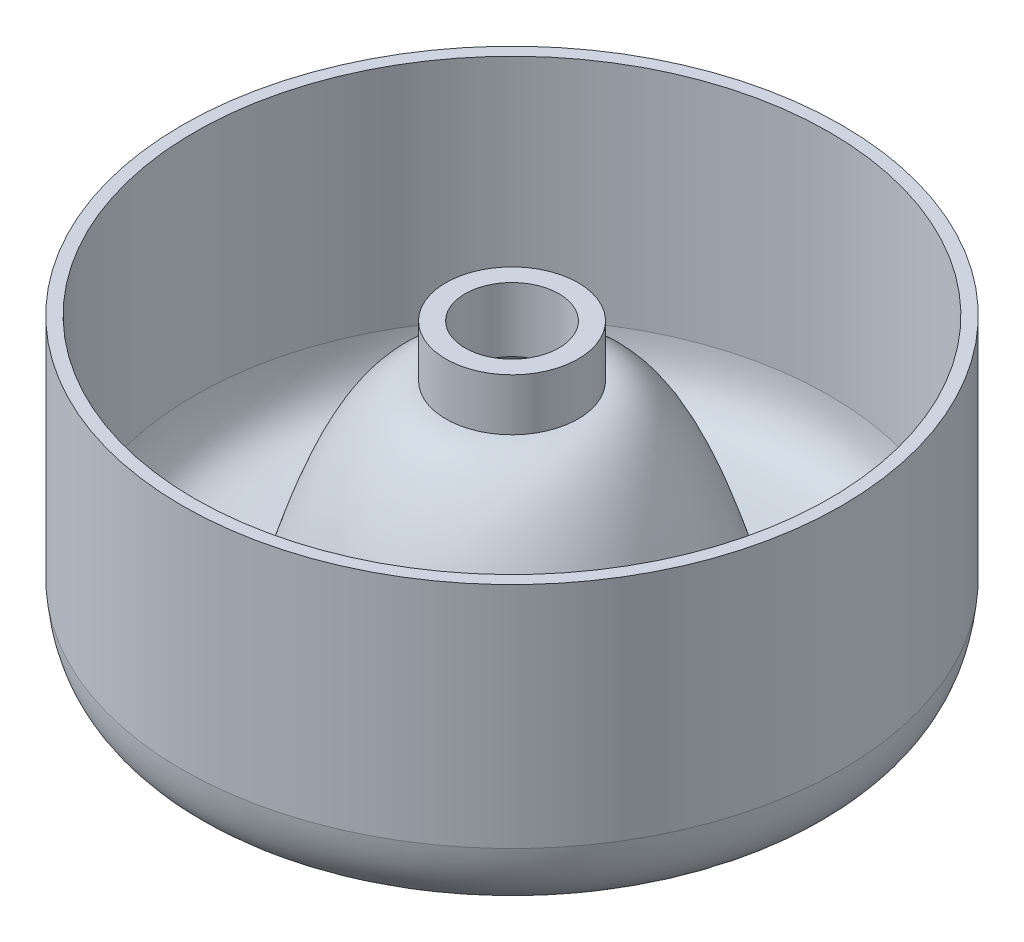
ISO-10303-21;
HEADER;
FILE_DESCRIPTION(('STEP AP214'),'2;1');
FILE_NAME('part.step','',(''),(''),'','','');
FILE_SCHEMA(('AUTOMOTIVE_DESIGN { 1 0 10303 214 1 1 1 1 }'));
ENDSEC;
DATA;
#1=APPLICATION_CONTEXT('core data for automotive mechanical design processes');
#2=APPLICATION_PROTOCOL_DEFINITION('international standard','automotive_design',2000,#1);
#3=PRODUCT_CONTEXT('',#1,'mechanical');
#4=PRODUCT('Part','Part','',(#3));
#5=PRODUCT_RELATED_PRODUCT_CATEGORY('part','',(#4));
#6=PRODUCT_DEFINITION_FORMATION('','',#4);
#7=PRODUCT_DEFINITION_CONTEXT('part definition',#1,'design');
#8=PRODUCT_DEFINITION('design','',#6,#7);
#9=PRODUCT_DEFINITION_SHAPE('','',#8);
#10=(LENGTH_UNIT() NAMED_UNIT(*) SI_UNIT(.MILLI.,.METRE.));
#11=(NAMED_UNIT(*) PLANE_ANGLE_UNIT() SI_UNIT($,.RADIAN.));
#12=(NAMED_UNIT(*) SI_UNIT($,.STERADIAN.) SOLID_ANGLE_UNIT());
#13=UNCERTAINTY_MEASURE_WITH_UNIT(LENGTH_MEASURE(1.E-05),#10,'distance_accuracy_value','');
#14=(GEOMETRIC_REPRESENTATION_CONTEXT(3) GLOBAL_UNCERTAINTY_ASSIGNED_CONTEXT((#13)) GLOBAL_UNIT_ASSIGNED_CONTEXT((#10,
#11,#12)) REPRESENTATION_CONTEXT('',''));
#15=CARTESIAN_POINT('',(0.,0.,0.));
#16=DIRECTION('',(0.,0.,1.));
#17=DIRECTION('',(1.,0.,0.));
#18=AXIS2_PLACEMENT_3D('',#15,#16,#17);
#19=CARTESIAN_POINT('',(-10.5000001564622,31.5224009475669,-0.000983807365130007));
#20=DIRECTION('',(0.,-1.,0.));
#21=DIRECTION('',(0.,0.,-1.));
#22=AXIS2_PLACEMENT_3D('',#19,#20,#21);
#23=PLANE('',#22);
#24=CARTESIAN_POINT('',(0.,31.5224009475669,-0.000983807365130007));
#25=DIRECTION('',(0.,-1.,0.));
#26=DIRECTION('',(0.,0.,-1.));
#27=AXIS2_PLACEMENT_3D('',#24,#25,#26);
#28=CIRCLE('',#27,10.5000001564622);
#29=CARTESIAN_POINT('',(0.,31.5224009475669,-10.5009839638273));
#30=VERTEX_POINT('',#29);
#31=EDGE_CURVE('E75',#30,#30,#28,.T.);
#32=ORIENTED_EDGE('',*,*,#31,.F.);
#33=EDGE_LOOP('',(#32));
#34=FACE_BOUND('',#33,.T.);
#35=CARTESIAN_POINT('',(0.,31.5224009475669,-0.000983807365130007));
#36=DIRECTION('',(0.,-1.,0.));
#37=DIRECTION('',(0.,0.,-1.));
#38=AXIS2_PLACEMENT_3D('',#35,#36,#37);
#39=CIRCLE('',#38,7.46044354353954);
#40=CARTESIAN_POINT('',(0.,31.5224009475669,-7.46142735090467));
#41=VERTEX_POINT('',#40);
#42=EDGE_CURVE('E10',#41,#41,#39,.T.);
#43=ORIENTED_EDGE('',*,*,#42,.T.);
#44=EDGE_LOOP('',(#43));
#45=FACE_BOUND('',#44,.T.);
#46=ADVANCED_FACE('F32',(#34,#45),#23,.F.);
#47=CARTESIAN_POINT('',(0.,-2.22759829806177,-0.000983807365130007));
#48=DIRECTION('',(0.,-1.,0.));
#49=DIRECTION('',(0.,0.,-1.));
#50=AXIS2_PLACEMENT_3D('',#47,#48,#49);
#51=CYLINDRICAL_SURFACE('',#50,7.46044354353954);
#52=ORIENTED_EDGE('',*,*,#42,.F.);
#53=EDGE_LOOP('',(#52));
#54=FACE_BOUND('',#53,.T.);
#55=CARTESIAN_POINT('',(0.,21.3282735019453,-0.000983807365130007));
#56=DIRECTION('',(0.,-1.,0.));
#57=DIRECTION('',(0.,0.,-1.));
#58=AXIS2_PLACEMENT_3D('',#55,#56,#57);
#59=CIRCLE('',#58,7.46044354353954);
#60=CARTESIAN_POINT('',(0.,21.3282735019453,-7.46142735090467));
#61=VERTEX_POINT('',#60);
#62=EDGE_CURVE('E38',#61,#61,#59,.T.);
#63=ORIENTED_EDGE('',*,*,#62,.T.);
#64=EDGE_LOOP('',(#63));
#65=FACE_BOUND('',#64,.T.);
#66=ADVANCED_FACE('F99',(#54,#65),#51,.F.);
#67=CARTESIAN_POINT('',(0.,21.334111256976,-0.000983807365130007));
#68=DIRECTION('',(0.,1.,0.));
#69=DIRECTION('',(0.,0.,1.));
#70=AXIS2_PLACEMENT_3D('',#67,#68,#69);
#71=CONICAL_SURFACE('',#70,9.41044354353954,1.56780261520986);
#72=ORIENTED_EDGE('',*,*,#62,.F.);
#73=EDGE_LOOP('',(#72));
#74=FACE_BOUND('',#73,.T.);
#75=CARTESIAN_POINT('',(0.,21.334111256976,-0.000983807365130007));
#76=DIRECTION('',(0.,-1.,0.));
#77=DIRECTION('',(0.,0.,-1.));
#78=AXIS2_PLACEMENT_3D('',#75,#76,#77);
#79=CIRCLE('',#78,9.41044354353954);
#80=CARTESIAN_POINT('',(0.,21.334111256976,-9.41142735090467));
#81=VERTEX_POINT('',#80);
#82=EDGE_CURVE('E42',#81,#81,#79,.T.);
#83=ORIENTED_EDGE('',*,*,#82,.T.);
#84=EDGE_LOOP('',(#83));
#85=FACE_BOUND('',#84,.T.);
#86=ADVANCED_FACE('F95',(#74,#85),#71,.T.);
#87=CARTESIAN_POINT('',(-28.6101147434179,-14.160177379984,-0.000983807365130007));
#88=CARTESIAN_POINT('',(-27.9821194630808,-11.8553368547939,-0.000983807365130007));
#89=CARTESIAN_POINT('',(-26.7127786727464,-7.22827568507408,-0.000983807365130007));
#90=CARTESIAN_POINT('',(-24.0373463414327,1.81986874336938,-0.000983807365130007));
#91=CARTESIAN_POINT('',(-21.072485671659,9.99215321360023,-0.000983807365130007));
#92=CARTESIAN_POINT('',(-17.7165525884176,16.1525884550296,-0.000983807365130007));
#93=CARTESIAN_POINT('',(-15.4898250683097,18.902855166596,-0.000983807365130007));
#94=CARTESIAN_POINT('',(-13.7062190726266,20.3257827333247,-0.000983807365130007));
#95=CARTESIAN_POINT('',(-12.6115595763688,20.8950621967732,-0.000983807365130007));
#96=CARTESIAN_POINT('',(-11.7361138274762,21.1734620343359,-0.000983807365130007));
#97=CARTESIAN_POINT('',(-11.1878181796386,21.2768801744244,-0.000983807365130007));
#98=CARTESIAN_POINT('',(-10.7845462511163,21.312434100766,-0.000983807365130007));
#99=CARTESIAN_POINT('',(-10.567810068522,21.321915059629,-0.000983807365130007));
#100=CARTESIAN_POINT('',(-10.1431555908023,21.3257050892891,-0.000983807365130007));
#101=CARTESIAN_POINT('',(-9.72459420350219,21.3307020440938,-0.000983807365130007));
#102=CARTESIAN_POINT('',(-9.41044354353954,21.334111256976,-0.000983807365130007));
#103=B_SPLINE_CURVE_WITH_KNOTS('',3,(#87,#88,#89,#90,#91,#92,#93,#94,#95,#96,#97,#98,#99,#100,
#101,#102),.UNSPECIFIED.,.F.,.F.,(4,1,1,1,1,1,1,1,1,1,1,1,1,4),(-0.0368035306305427,
0.0930567663784551,0.222917063387453,0.482637657405449,0.612497954414446,0.742358251423444,
0.807288399927943,0.872218548432442,0.904683622684692,0.937148696936941,0.953381234063066,
0.961497502626128,0.969613771189191,1.00207884544144),.UNSPECIFIED.);
#104=CARTESIAN_POINT('',(0.,-2.22759829806177,-0.000983807365130007));
#105=DIRECTION('',(0.,-1.,0.));
#106=AXIS1_PLACEMENT('',#104,#105);
#107=SURFACE_OF_REVOLUTION('',#103,#106);
#108=ORIENTED_EDGE('',*,*,#82,.F.);
#109=EDGE_LOOP('',(#108));
#110=FACE_BOUND('',#109,.T.);
#111=CARTESIAN_POINT('',(0.,-14.160177379984,-0.000983807365130007));
#112=DIRECTION('',(0.,-1.,0.));
#113=DIRECTION('',(0.,0.,-1.));
#114=AXIS2_PLACEMENT_3D('',#111,#112,#113);
#115=CIRCLE('',#114,28.6101147434179);
#116=CARTESIAN_POINT('',(0.,-14.160177379984,-28.611098550783));
#117=VERTEX_POINT('',#116);
#118=EDGE_CURVE('E46',#117,#117,#115,.T.);
#119=ORIENTED_EDGE('',*,*,#118,.T.);
#120=EDGE_LOOP('',(#119));
#121=FACE_BOUND('',#120,.T.);
#122=ADVANCED_FACE('F90',(#110,#121),#107,.T.);
#123=CARTESIAN_POINT('',(0.,-13.0110383247906,-0.000983807365130007));
#124=DIRECTION('',(0.,-1.,0.));
#125=DIRECTION('',(0.,0.,-1.));
#126=AXIS2_PLACEMENT_3D('',#123,#124,#125);
#127=TOROIDAL_SURFACE('',#126,31.6463487840662,3.24641921472915);
#128=ORIENTED_EDGE('',*,*,#118,.F.);
#129=EDGE_LOOP('',(#128));
#130=FACE_BOUND('',#129,.T.);
#131=CARTESIAN_POINT('',(0.,-16.2508571143823,-0.000983807365130007));
#132=DIRECTION('',(0.,-1.,0.));
#133=DIRECTION('',(0.,0.,-1.));
#134=AXIS2_PLACEMENT_3D('',#131,#132,#133);
#135=CIRCLE('',#134,31.4394383484397);
#136=CARTESIAN_POINT('',(0.,-16.2508571143823,-31.4404221558048));
#137=VERTEX_POINT('',#136);
#138=EDGE_CURVE('E51',#137,#137,#135,.T.);
#139=ORIENTED_EDGE('',*,*,#138,.T.);
#140=EDGE_LOOP('',(#139));
#141=FACE_BOUND('',#140,.T.);
#142=ADVANCED_FACE('F94',(#130,#141),#127,.T.);
#143=CARTESIAN_POINT('',(-52.358430227729,-4.02526625830926,-0.000983807365130007));
#144=CARTESIAN_POINT('',(-52.2959712129034,-4.70143165706182,-0.000983807365130007));
#145=CARTESIAN_POINT('',(-52.1261597714938,-6.09611042308822,-0.000983807365130007));
#146=CARTESIAN_POINT('',(-51.7384680575629,-7.89014698456724,-0.000983807365130007));
#147=CARTESIAN_POINT('',(-51.1962867216409,-9.51901503795333,-0.000983807365130007));
#148=CARTESIAN_POINT('',(-50.2429071381774,-11.4463821545435,-0.000983807365130007));
#149=CARTESIAN_POINT('',(-48.5597985918503,-13.3948730218555,-0.000983807365130007));
#150=CARTESIAN_POINT('',(-45.9367379744039,-14.8339374877489,-0.000983807365130007));
#151=CARTESIAN_POINT('',(-42.9755592973976,-15.5800607549059,-0.000983807365130007));
#152=CARTESIAN_POINT('',(-39.6452068946546,-15.9350054400003,-0.000983807365130007));
#153=CARTESIAN_POINT('',(-36.4772702395829,-16.0711756838056,-0.000983807365130007));
#154=CARTESIAN_POINT('',(-33.7048536869908,-16.1637966507844,-0.000983807365130007));
#155=CARTESIAN_POINT('',(-32.183187342686,-16.22011419339,-0.000983807365130007));
#156=CARTESIAN_POINT('',(-31.4394383484397,-16.2508571143823,-0.000983807365130007));
#157=B_SPLINE_CURVE_WITH_KNOTS('',3,(#143,#144,#145,#146,#147,#148,#149,#150,#151,#152,#153,
#154,#155,#156),.UNSPECIFIED.,.F.,.F.,(4,1,1,1,1,1,1,1,1,1,1,4),(-0.00281531472904661,
0.0600742115453683,0.122963737819783,0.185853264094198,0.248742790368613,0.374521842917443,
0.500300895466273,0.626079948015103,0.751859000563933,0.877638053112763,0.940527579387178,
1.00341710566159),.UNSPECIFIED.);
#158=CARTESIAN_POINT('',(0.,-2.22759829806177,-0.000983807365130007));
#159=DIRECTION('',(0.,-1.,0.));
#160=AXIS1_PLACEMENT('',#158,#159);
#161=SURFACE_OF_REVOLUTION('',#157,#160);
#162=ORIENTED_EDGE('',*,*,#138,.F.);
#163=EDGE_LOOP('',(#162));
#164=FACE_BOUND('',#163,.T.);
#165=CARTESIAN_POINT('',(0.,-4.02526625830926,-0.000983807365130007));
#166=DIRECTION('',(0.,-1.,0.));
#167=DIRECTION('',(0.,0.,-1.));
#168=AXIS2_PLACEMENT_3D('',#165,#166,#167);
#169=CIRCLE('',#168,52.358430227729);
#170=CARTESIAN_POINT('',(0.,-4.02526625830926,-52.3594140350941));
#171=VERTEX_POINT('',#170);
#172=EDGE_CURVE('E54',#171,#171,#169,.T.);
#173=ORIENTED_EDGE('',*,*,#172,.T.);
#174=EDGE_LOOP('',(#173));
#175=FACE_BOUND('',#174,.T.);
#176=ADVANCED_FACE('F152',(#164,#175),#161,.T.);
#177=CARTESIAN_POINT('',(0.,-2.22759829806177,-0.000983807365130007));
#178=DIRECTION('',(0.,-1.,0.));
#179=DIRECTION('',(0.,0.,-1.));
#180=AXIS2_PLACEMENT_3D('',#177,#178,#179);
#181=CYLINDRICAL_SURFACE('',#180,52.358430227729);
#182=ORIENTED_EDGE('',*,*,#172,.F.);
#183=EDGE_LOOP('',(#182));
#184=FACE_BOUND('',#183,.T.);
#185=CARTESIAN_POINT('',(0.,32.2724009308031,-0.000983807365130007));
#186=DIRECTION('',(0.,-1.,0.));
#187=DIRECTION('',(0.,0.,-1.));
#188=AXIS2_PLACEMENT_3D('',#185,#186,#187);
#189=CIRCLE('',#188,52.358430227729);
#190=CARTESIAN_POINT('',(0.,32.2724009308031,-52.3594140350941));
#191=VERTEX_POINT('',#190);
#192=EDGE_CURVE('E57',#191,#191,#189,.T.);
#193=ORIENTED_EDGE('',*,*,#192,.T.);
#194=EDGE_LOOP('',(#193));
#195=FACE_BOUND('',#194,.T.);
#196=ADVANCED_FACE('F149',(#184,#195),#181,.T.);
#197=CARTESIAN_POINT('',(-50.408430227729,32.2724009308031,-0.000983807365130007));
#198=DIRECTION('',(0.,-1.,0.));
#199=DIRECTION('',(0.,0.,-1.));
#200=AXIS2_PLACEMENT_3D('',#197,#198,#199);
#201=PLANE('',#200);
#202=ORIENTED_EDGE('',*,*,#192,.F.);
#203=EDGE_LOOP('',(#202));
#204=FACE_BOUND('',#203,.T.);
#205=CARTESIAN_POINT('',(0.,32.2724009308031,-0.000983807365130007));
#206=DIRECTION('',(0.,-1.,0.));
#207=DIRECTION('',(0.,0.,-1.));
#208=AXIS2_PLACEMENT_3D('',#205,#206,#207);
#209=CIRCLE('',#208,50.408430227729);
#210=CARTESIAN_POINT('',(0.,32.2724009308031,-50.4094140350941));
#211=VERTEX_POINT('',#210);
#212=EDGE_CURVE('E60',#211,#211,#209,.T.);
#213=ORIENTED_EDGE('',*,*,#212,.T.);
#214=EDGE_LOOP('',(#213));
#215=FACE_BOUND('',#214,.T.);
#216=ADVANCED_FACE('F145',(#204,#215),#201,.F.);
#217=CARTESIAN_POINT('',(0.,-2.22759829806177,-0.000983807365130007));
#218=DIRECTION('',(0.,-1.,0.));
#219=DIRECTION('',(0.,0.,-1.));
#220=AXIS2_PLACEMENT_3D('',#217,#218,#219);
#221=CYLINDRICAL_SURFACE('',#220,50.408430227729);
#222=ORIENTED_EDGE('',*,*,#212,.F.);
#223=EDGE_LOOP('',(#222));
#224=FACE_BOUND('',#223,.T.);
#225=CARTESIAN_POINT('',(0.,-3.93539448083501,-0.000983807365130007));
#226=DIRECTION('',(0.,-1.,0.));
#227=DIRECTION('',(0.,0.,-1.));
#228=AXIS2_PLACEMENT_3D('',#225,#226,#227);
#229=CIRCLE('',#228,50.408430227729);
#230=CARTESIAN_POINT('',(0.,-3.93539448083501,-50.4094140350941));
#231=VERTEX_POINT('',#230);
#232=EDGE_CURVE('E63',#231,#231,#229,.T.);
#233=ORIENTED_EDGE('',*,*,#232,.T.);
#234=EDGE_LOOP('',(#233));
#235=FACE_BOUND('',#234,.T.);
#236=ADVANCED_FACE('F141',(#224,#235),#221,.F.);
#237=CARTESIAN_POINT('',(-31.4845855571661,-14.2973257882846,-0.000983807365130007));
#238=CARTESIAN_POINT('',(-43.7446527912475,-13.7905549808563,-0.000983807365130007));
#239=CARTESIAN_POINT('',(-49.4296789822616,-14.5311063731769,-0.000983807365130007));
#240=CARTESIAN_POINT('',(-50.408430227729,-3.93539448083501,-0.000983807365130007));
#241=B_SPLINE_CURVE_WITH_KNOTS('',3,(#237,#238,#239,#240),.UNSPECIFIED.,.F.,.F.,(4,4),(0.,1.),.UNSPECIFIED.);
#242=CARTESIAN_POINT('',(0.,-2.22759829806177,-0.000983807365130007));
#243=DIRECTION('',(0.,-1.,0.));
#244=AXIS1_PLACEMENT('',#242,#243);
#245=SURFACE_OF_REVOLUTION('',#241,#244);
#246=ORIENTED_EDGE('',*,*,#232,.F.);
#247=EDGE_LOOP('',(#246));
#248=FACE_BOUND('',#247,.T.);
#249=CARTESIAN_POINT('',(0.,-14.2973257882846,-0.000983807365130007));
#250=DIRECTION('',(0.,-1.,0.));
#251=DIRECTION('',(0.,0.,-1.));
#252=AXIS2_PLACEMENT_3D('',#249,#250,#251);
#253=CIRCLE('',#252,31.4845855571661);
#254=CARTESIAN_POINT('',(0.,-14.2973257882846,-31.4855693645313));
#255=VERTEX_POINT('',#254);
#256=EDGE_CURVE('E66',#255,#255,#253,.T.);
#257=ORIENTED_EDGE('',*,*,#256,.T.);
#258=EDGE_LOOP('',(#257));
#259=FACE_BOUND('',#258,.T.);
#260=ADVANCED_FACE('F138',(#248,#259),#245,.T.);
#261=CARTESIAN_POINT('',(0.,-13.0110383247906,-0.000983807365130007));
#262=DIRECTION('',(0.,-1.,0.));
#263=DIRECTION('',(0.,0.,-1.));
#264=AXIS2_PLACEMENT_3D('',#261,#262,#263);
#265=TOROIDAL_SURFACE('',#264,31.6463487840662,1.29641921472915);
#266=ORIENTED_EDGE('',*,*,#256,.F.);
#267=EDGE_LOOP('',(#266));
#268=FACE_BOUND('',#267,.T.);
#269=CARTESIAN_POINT('',(0.,-13.5369448052381,-0.000983807365130007));
#270=DIRECTION('',(0.,-1.,0.));
#271=DIRECTION('',(0.,0.,-1.));
#272=AXIS2_PLACEMENT_3D('',#269,#270,#271);
#273=CIRCLE('',#272,30.461390913869);
#274=CARTESIAN_POINT('',(0.,-13.5369448052381,-30.4623747212341));
#275=VERTEX_POINT('',#274);
#276=EDGE_CURVE('E69',#275,#275,#273,.T.);
#277=ORIENTED_EDGE('',*,*,#276,.T.);
#278=EDGE_LOOP('',(#277));
#279=FACE_BOUND('',#278,.T.);
#280=ADVANCED_FACE('F119',(#268,#279),#265,.F.);
#281=CARTESIAN_POINT('',(-10.5000001564622,23.2724020372143,-0.000983807365130007));
#282=CARTESIAN_POINT('',(-20.1765731259784,23.1673903296859,-0.000983807365130007));
#283=CARTESIAN_POINT('',(-25.6290525493851,4.19848990681264,-0.000983807365130007));
#284=CARTESIAN_POINT('',(-30.461390913869,-13.5369448052381,-0.000983807365130007));
#285=B_SPLINE_CURVE_WITH_KNOTS('',3,(#281,#282,#283,#284),.UNSPECIFIED.,.F.,.F.,(4,4),(0.,1.),.UNSPECIFIED.);
#286=CARTESIAN_POINT('',(0.,-2.22759829806177,-0.000983807365130007));
#287=DIRECTION('',(0.,-1.,0.));
#288=AXIS1_PLACEMENT('',#286,#287);
#289=SURFACE_OF_REVOLUTION('',#285,#288);
#290=ORIENTED_EDGE('',*,*,#276,.F.);
#291=EDGE_LOOP('',(#290));
#292=FACE_BOUND('',#291,.T.);
#293=CARTESIAN_POINT('',(0.,23.2724020372143,-0.000983807365130007));
#294=DIRECTION('',(0.,-1.,0.));
#295=DIRECTION('',(0.,0.,-1.));
#296=AXIS2_PLACEMENT_3D('',#293,#294,#295);
#297=CIRCLE('',#296,10.5000001564622);
#298=CARTESIAN_POINT('',(0.,23.2724020372143,-10.5009839638273));
#299=VERTEX_POINT('',#298);
#300=EDGE_CURVE('E72',#299,#299,#297,.T.);
#301=ORIENTED_EDGE('',*,*,#300,.T.);
#302=EDGE_LOOP('',(#301));
#303=FACE_BOUND('',#302,.T.);
#304=ADVANCED_FACE('F113',(#292,#303),#289,.T.);
#305=CARTESIAN_POINT('',(0.,-2.22759829806177,-0.000983807365130007));
#306=DIRECTION('',(0.,-1.,0.));
#307=DIRECTION('',(0.,0.,-1.));
#308=AXIS2_PLACEMENT_3D('',#305,#306,#307);
#309=CYLINDRICAL_SURFACE('',#308,10.5000001564622);
#310=ORIENTED_EDGE('',*,*,#300,.F.);
#311=EDGE_LOOP('',(#310));
#312=FACE_BOUND('',#311,.T.);
#313=ORIENTED_EDGE('',*,*,#31,.T.);
#314=EDGE_LOOP('',(#313));
#315=FACE_BOUND('',#314,.T.);
#316=ADVANCED_FACE('F111',(#312,#315),#309,.T.);
#317=CLOSED_SHELL('',(#46,#66,#86,#122,#142,#176,#196,#216,#236,#260,#280,#304,#316));
#318=MANIFOLD_SOLID_BREP('B2',#317);
#319=ADVANCED_BREP_SHAPE_REPRESENTATION('',(#18,#318),#14);
#320=SHAPE_DEFINITION_REPRESENTATION(#9,#319);
ENDSEC;
END-ISO-10303-21;
